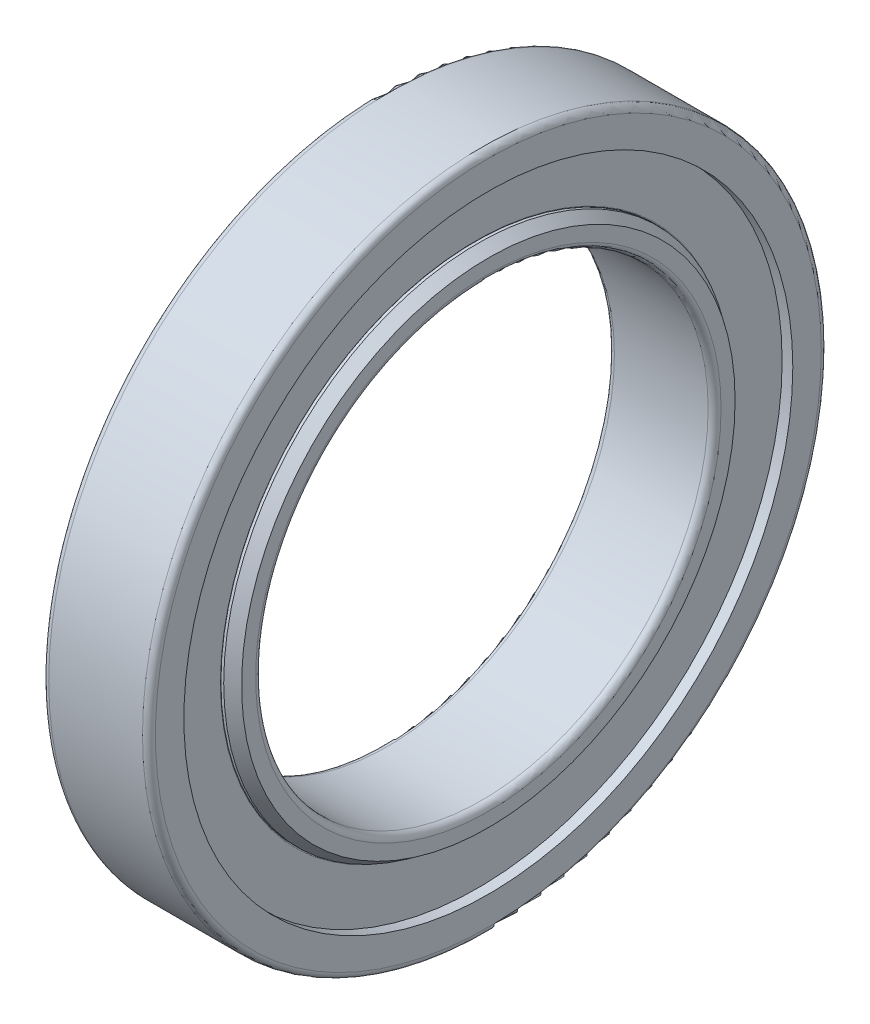
ISO-10303-21;
HEADER;
FILE_DESCRIPTION(('STEP AP214'),'2;1');
FILE_NAME('part.step','',(''),(''),'','','');
FILE_SCHEMA(('AUTOMOTIVE_DESIGN { 1 0 10303 214 1 1 1 1 }'));
ENDSEC;
DATA;
#1=APPLICATION_CONTEXT('core data for automotive mechanical design processes');
#2=APPLICATION_PROTOCOL_DEFINITION('international standard','automotive_design',2000,#1);
#3=PRODUCT_CONTEXT('',#1,'mechanical');
#4=PRODUCT('Part','Part','',(#3));
#5=PRODUCT_RELATED_PRODUCT_CATEGORY('part','',(#4));
#6=PRODUCT_DEFINITION_FORMATION('','',#4);
#7=PRODUCT_DEFINITION_CONTEXT('part definition',#1,'design');
#8=PRODUCT_DEFINITION('design','',#6,#7);
#9=PRODUCT_DEFINITION_SHAPE('','',#8);
#10=(LENGTH_UNIT() NAMED_UNIT(*) SI_UNIT(.MILLI.,.METRE.));
#11=(NAMED_UNIT(*) PLANE_ANGLE_UNIT() SI_UNIT($,.RADIAN.));
#12=(NAMED_UNIT(*) SI_UNIT($,.STERADIAN.) SOLID_ANGLE_UNIT());
#13=UNCERTAINTY_MEASURE_WITH_UNIT(LENGTH_MEASURE(1.E-05),#10,'distance_accuracy_value','');
#14=(GEOMETRIC_REPRESENTATION_CONTEXT(3) GLOBAL_UNCERTAINTY_ASSIGNED_CONTEXT((#13)) GLOBAL_UNIT_ASSIGNED_CONTEXT((#10,
#11,#12)) REPRESENTATION_CONTEXT('',''));
#15=CARTESIAN_POINT('',(0.,0.,0.));
#16=DIRECTION('',(0.,0.,1.));
#17=DIRECTION('',(1.,0.,0.));
#18=AXIS2_PLACEMENT_3D('',#15,#16,#17);
#19=CARTESIAN_POINT('',(-90.,0.,0.));
#20=DIRECTION('',(1.,0.,0.));
#21=DIRECTION('',(0.,0.,-1.));
#22=AXIS2_PLACEMENT_3D('',#19,#20,#21);
#23=CYLINDRICAL_SURFACE('',#22,96.425);
#24=CARTESIAN_POINT('',(-12.2423566956771,0.,0.));
#25=DIRECTION('',(1.,0.,0.));
#26=DIRECTION('',(0.,0.,-1.));
#27=AXIS2_PLACEMENT_3D('',#24,#25,#26);
#28=CIRCLE('',#27,96.425);
#29=CARTESIAN_POINT('',(-12.2423566956771,0.,-96.425));
#30=VERTEX_POINT('',#29);
#31=EDGE_CURVE('E42',#30,#30,#28,.F.);
#32=ORIENTED_EDGE('',*,*,#31,.F.);
#33=EDGE_LOOP('',(#32));
#34=FACE_BOUND('',#33,.T.);
#35=CARTESIAN_POINT('',(-13.2,0.,0.));
#36=DIRECTION('',(1.,0.,0.));
#37=DIRECTION('',(0.,0.,-1.));
#38=AXIS2_PLACEMENT_3D('',#35,#36,#37);
#39=CIRCLE('',#38,96.425);
#40=CARTESIAN_POINT('',(-13.2,0.,-96.425));
#41=VERTEX_POINT('',#40);
#42=EDGE_CURVE('E59',#41,#41,#39,.T.);
#43=ORIENTED_EDGE('',*,*,#42,.F.);
#44=EDGE_LOOP('',(#43));
#45=FACE_BOUND('',#44,.T.);
#46=ADVANCED_FACE('F30',(#34,#45),#23,.F.);
#47=CARTESIAN_POINT('',(-13.2,96.425,0.));
#48=DIRECTION('',(1.,0.,0.));
#49=DIRECTION('',(0.,0.,-1.));
#50=AXIS2_PLACEMENT_3D('',#47,#48,#49);
#51=PLANE('',#50);
#52=ORIENTED_EDGE('',*,*,#42,.T.);
#53=EDGE_LOOP('',(#52));
#54=FACE_BOUND('',#53,.T.);
#55=CARTESIAN_POINT('',(-13.2,0.,0.));
#56=DIRECTION('',(1.,0.,0.));
#57=DIRECTION('',(0.,0.,-1.));
#58=AXIS2_PLACEMENT_3D('',#55,#56,#57);
#59=CIRCLE('',#58,94.19375);
#60=CARTESIAN_POINT('',(-13.2,0.,-94.19375));
#61=VERTEX_POINT('',#60);
#62=EDGE_CURVE('E86',#61,#61,#59,.T.);
#63=ORIENTED_EDGE('',*,*,#62,.F.);
#64=EDGE_LOOP('',(#63));
#65=FACE_BOUND('',#64,.T.);
#66=ADVANCED_FACE('F32',(#54,#65),#51,.T.);
#67=CARTESIAN_POINT('',(-90.,0.,0.));
#68=DIRECTION('',(1.,0.,0.));
#69=DIRECTION('',(0.,0.,-1.));
#70=AXIS2_PLACEMENT_3D('',#67,#68,#69);
#71=CYLINDRICAL_SURFACE('',#70,94.19375);
#72=ORIENTED_EDGE('',*,*,#62,.T.);
#73=EDGE_LOOP('',(#72));
#74=FACE_BOUND('',#73,.T.);
#75=CARTESIAN_POINT('',(-16.5,0.,0.));
#76=DIRECTION('',(1.,0.,0.));
#77=DIRECTION('',(0.,0.,-1.));
#78=AXIS2_PLACEMENT_3D('',#75,#76,#77);
#79=CIRCLE('',#78,94.19375);
#80=CARTESIAN_POINT('',(-16.5,0.,-94.19375));
#81=VERTEX_POINT('',#80);
#82=EDGE_CURVE('E83',#81,#81,#79,.T.);
#83=ORIENTED_EDGE('',*,*,#82,.F.);
#84=EDGE_LOOP('',(#83));
#85=FACE_BOUND('',#84,.T.);
#86=ADVANCED_FACE('F105',(#74,#85),#71,.F.);
#87=CARTESIAN_POINT('',(-16.5,94.19375,0.));
#88=DIRECTION('',(-1.,0.,0.));
#89=DIRECTION('',(0.,0.,1.));
#90=AXIS2_PLACEMENT_3D('',#87,#88,#89);
#91=PLANE('',#90);
#92=ORIENTED_EDGE('',*,*,#82,.T.);
#93=EDGE_LOOP('',(#92));
#94=FACE_BOUND('',#93,.T.);
#95=CARTESIAN_POINT('',(-16.5,0.,0.));
#96=DIRECTION('',(1.,0.,0.));
#97=DIRECTION('',(0.,0.,-1.));
#98=AXIS2_PLACEMENT_3D('',#95,#96,#97);
#99=CIRCLE('',#98,103.);
#100=CARTESIAN_POINT('',(-16.5,0.,-103.));
#101=VERTEX_POINT('',#100);
#102=EDGE_CURVE('E80',#101,#101,#99,.T.);
#103=ORIENTED_EDGE('',*,*,#102,.F.);
#104=EDGE_LOOP('',(#103));
#105=FACE_BOUND('',#104,.T.);
#106=ADVANCED_FACE('F110',(#94,#105),#91,.T.);
#107=CARTESIAN_POINT('',(-14.5,0.,0.));
#108=DIRECTION('',(1.,0.,0.));
#109=DIRECTION('',(0.,0.,-1.));
#110=AXIS2_PLACEMENT_3D('',#107,#108,#109);
#111=TOROIDAL_SURFACE('',#110,103.,2.00000000000002);
#112=ORIENTED_EDGE('',*,*,#102,.T.);
#113=EDGE_LOOP('',(#112));
#114=FACE_BOUND('',#113,.T.);
#115=CARTESIAN_POINT('',(-14.5,0.,0.));
#116=DIRECTION('',(1.,0.,0.));
#117=DIRECTION('',(0.,0.,-1.));
#118=AXIS2_PLACEMENT_3D('',#115,#116,#117);
#119=CIRCLE('',#118,105.);
#120=CARTESIAN_POINT('',(-14.5,0.,-105.));
#121=VERTEX_POINT('',#120);
#122=EDGE_CURVE('E77',#121,#121,#119,.T.);
#123=ORIENTED_EDGE('',*,*,#122,.F.);
#124=EDGE_LOOP('',(#123));
#125=FACE_BOUND('',#124,.T.);
#126=ADVANCED_FACE('F115',(#114,#125),#111,.T.);
#127=CARTESIAN_POINT('',(-90.,0.,0.));
#128=DIRECTION('',(1.,0.,0.));
#129=DIRECTION('',(0.,0.,-1.));
#130=AXIS2_PLACEMENT_3D('',#127,#128,#129);
#131=CYLINDRICAL_SURFACE('',#130,105.);
#132=ORIENTED_EDGE('',*,*,#122,.T.);
#133=EDGE_LOOP('',(#132));
#134=FACE_BOUND('',#133,.T.);
#135=CARTESIAN_POINT('',(14.5,0.,0.));
#136=DIRECTION('',(1.,0.,0.));
#137=DIRECTION('',(0.,0.,-1.));
#138=AXIS2_PLACEMENT_3D('',#135,#136,#137);
#139=CIRCLE('',#138,105.);
#140=CARTESIAN_POINT('',(14.5,0.,-105.));
#141=VERTEX_POINT('',#140);
#142=EDGE_CURVE('E74',#141,#141,#139,.T.);
#143=ORIENTED_EDGE('',*,*,#142,.F.);
#144=EDGE_LOOP('',(#143));
#145=FACE_BOUND('',#144,.T.);
#146=ADVANCED_FACE('F121',(#134,#145),#131,.T.);
#147=CARTESIAN_POINT('',(14.5,0.,0.));
#148=DIRECTION('',(1.,0.,0.));
#149=DIRECTION('',(0.,0.,-1.));
#150=AXIS2_PLACEMENT_3D('',#147,#148,#149);
#151=TOROIDAL_SURFACE('',#150,103.,2.00000000000001);
#152=ORIENTED_EDGE('',*,*,#142,.T.);
#153=EDGE_LOOP('',(#152));
#154=FACE_BOUND('',#153,.T.);
#155=CARTESIAN_POINT('',(16.5,0.,0.));
#156=DIRECTION('',(1.,0.,0.));
#157=DIRECTION('',(0.,0.,-1.));
#158=AXIS2_PLACEMENT_3D('',#155,#156,#157);
#159=CIRCLE('',#158,103.);
#160=CARTESIAN_POINT('',(16.5,0.,-103.));
#161=VERTEX_POINT('',#160);
#162=EDGE_CURVE('E71',#161,#161,#159,.T.);
#163=ORIENTED_EDGE('',*,*,#162,.F.);
#164=EDGE_LOOP('',(#163));
#165=FACE_BOUND('',#164,.T.);
#166=ADVANCED_FACE('F127',(#154,#165),#151,.T.);
#167=CARTESIAN_POINT('',(16.5,103.,0.));
#168=DIRECTION('',(1.,0.,0.));
#169=DIRECTION('',(0.,0.,-1.));
#170=AXIS2_PLACEMENT_3D('',#167,#168,#169);
#171=PLANE('',#170);
#172=ORIENTED_EDGE('',*,*,#162,.T.);
#173=EDGE_LOOP('',(#172));
#174=FACE_BOUND('',#173,.T.);
#175=CARTESIAN_POINT('',(16.5,0.,0.));
#176=DIRECTION('',(1.,0.,0.));
#177=DIRECTION('',(0.,0.,-1.));
#178=AXIS2_PLACEMENT_3D('',#175,#176,#177);
#179=CIRCLE('',#178,94.1937500000001);
#180=CARTESIAN_POINT('',(16.5,0.,-94.1937500000001));
#181=VERTEX_POINT('',#180);
#182=EDGE_CURVE('E68',#181,#181,#179,.T.);
#183=ORIENTED_EDGE('',*,*,#182,.F.);
#184=EDGE_LOOP('',(#183));
#185=FACE_BOUND('',#184,.T.);
#186=ADVANCED_FACE('F133',(#174,#185),#171,.T.);
#187=CARTESIAN_POINT('',(-90.,0.,0.));
#188=DIRECTION('',(1.,0.,0.));
#189=DIRECTION('',(0.,0.,-1.));
#190=AXIS2_PLACEMENT_3D('',#187,#188,#189);
#191=CYLINDRICAL_SURFACE('',#190,94.1937500000001);
#192=ORIENTED_EDGE('',*,*,#182,.T.);
#193=EDGE_LOOP('',(#192));
#194=FACE_BOUND('',#193,.T.);
#195=CARTESIAN_POINT('',(13.2,0.,0.));
#196=DIRECTION('',(1.,0.,0.));
#197=DIRECTION('',(0.,0.,-1.));
#198=AXIS2_PLACEMENT_3D('',#195,#196,#197);
#199=CIRCLE('',#198,94.1937500000001);
#200=CARTESIAN_POINT('',(13.2,0.,-94.1937500000001));
#201=VERTEX_POINT('',#200);
#202=EDGE_CURVE('E65',#201,#201,#199,.T.);
#203=ORIENTED_EDGE('',*,*,#202,.F.);
#204=EDGE_LOOP('',(#203));
#205=FACE_BOUND('',#204,.T.);
#206=ADVANCED_FACE('F139',(#194,#205),#191,.F.);
#207=CARTESIAN_POINT('',(13.2,94.1937500000001,0.));
#208=DIRECTION('',(-1.,0.,0.));
#209=DIRECTION('',(0.,0.,1.));
#210=AXIS2_PLACEMENT_3D('',#207,#208,#209);
#211=PLANE('',#210);
#212=ORIENTED_EDGE('',*,*,#202,.T.);
#213=EDGE_LOOP('',(#212));
#214=FACE_BOUND('',#213,.T.);
#215=CARTESIAN_POINT('',(13.2,0.,0.));
#216=DIRECTION('',(1.,0.,0.));
#217=DIRECTION('',(0.,0.,-1.));
#218=AXIS2_PLACEMENT_3D('',#215,#216,#217);
#219=CIRCLE('',#218,96.425);
#220=CARTESIAN_POINT('',(13.2,0.,-96.425));
#221=VERTEX_POINT('',#220);
#222=EDGE_CURVE('E62',#221,#221,#219,.T.);
#223=ORIENTED_EDGE('',*,*,#222,.F.);
#224=EDGE_LOOP('',(#223));
#225=FACE_BOUND('',#224,.T.);
#226=ADVANCED_FACE('F145',(#214,#225),#211,.T.);
#227=CARTESIAN_POINT('',(12.2423566956772,0.,0.));
#228=DIRECTION('',(-1.,0.,0.));
#229=DIRECTION('',(0.,0.,1.));
#230=AXIS2_PLACEMENT_3D('',#227,#228,#229);
#231=CIRCLE('',#230,96.425);
#232=CARTESIAN_POINT('',(12.2423566956772,0.,96.425));
#233=VERTEX_POINT('',#232);
#234=EDGE_CURVE('E89',#233,#233,#231,.F.);
#235=ORIENTED_EDGE('',*,*,#234,.F.);
#236=EDGE_LOOP('',(#235));
#237=FACE_BOUND('',#236,.T.);
#238=ORIENTED_EDGE('',*,*,#222,.T.);
#239=EDGE_LOOP('',(#238));
#240=FACE_BOUND('',#239,.T.);
#241=ADVANCED_FACE('F100',(#237,#240),#23,.F.);
#242=CARTESIAN_POINT('',(-12.1828,0.,0.));
#243=DIRECTION('',(1.,0.,0.));
#244=DIRECTION('',(0.,0.,-1.));
#245=AXIS2_PLACEMENT_3D('',#242,#243,#244);
#246=TOROIDAL_SURFACE('',#245,96.0728,0.357199999999995);
#247=ORIENTED_EDGE('',*,*,#31,.T.);
#248=EDGE_LOOP('',(#247));
#249=FACE_BOUND('',#248,.T.);
#250=CARTESIAN_POINT('',(-12.54,0.,0.));
#251=DIRECTION('',(1.,0.,0.));
#252=DIRECTION('',(0.,0.,-1.));
#253=AXIS2_PLACEMENT_3D('',#250,#251,#252);
#254=CIRCLE('',#253,96.0728);
#255=CARTESIAN_POINT('',(-12.54,0.,-96.0728));
#256=VERTEX_POINT('',#255);
#257=EDGE_CURVE('E56',#256,#256,#254,.T.);
#258=ORIENTED_EDGE('',*,*,#257,.T.);
#259=EDGE_LOOP('',(#258));
#260=FACE_BOUND('',#259,.T.);
#261=ADVANCED_FACE('F94',(#249,#260),#246,.T.);
#262=CARTESIAN_POINT('',(-12.54,96.0728,0.));
#263=DIRECTION('',(-1.,0.,0.));
#264=DIRECTION('',(0.,0.,1.));
#265=AXIS2_PLACEMENT_3D('',#262,#263,#264);
#266=PLANE('',#265);
#267=CARTESIAN_POINT('',(-12.54,0.,0.));
#268=DIRECTION('',(1.,0.,0.));
#269=DIRECTION('',(0.,0.,-1.));
#270=AXIS2_PLACEMENT_3D('',#267,#268,#269);
#271=CIRCLE('',#270,78.9272);
#272=CARTESIAN_POINT('',(-12.54,0.,-78.9272));
#273=VERTEX_POINT('',#272);
#274=EDGE_CURVE('E53',#273,#273,#271,.T.);
#275=ORIENTED_EDGE('',*,*,#274,.T.);
#276=EDGE_LOOP('',(#275));
#277=FACE_BOUND('',#276,.T.);
#278=ORIENTED_EDGE('',*,*,#257,.F.);
#279=EDGE_LOOP('',(#278));
#280=FACE_BOUND('',#279,.T.);
#281=ADVANCED_FACE('F159',(#277,#280),#266,.T.);
#282=CARTESIAN_POINT('',(-12.1828,0.,0.));
#283=DIRECTION('',(1.,0.,0.));
#284=DIRECTION('',(0.,0.,-1.));
#285=AXIS2_PLACEMENT_3D('',#282,#283,#284);
#286=TOROIDAL_SURFACE('',#285,78.9272,0.357200000000002);
#287=CARTESIAN_POINT('',(-12.2423566956775,0.,0.));
#288=DIRECTION('',(1.,0.,0.));
#289=DIRECTION('',(0.,0.,-1.));
#290=AXIS2_PLACEMENT_3D('',#287,#288,#289);
#291=CIRCLE('',#290,78.575);
#292=CARTESIAN_POINT('',(-12.2423566956775,0.,-78.575));
#293=VERTEX_POINT('',#292);
#294=EDGE_CURVE('E10',#293,#293,#291,.F.);
#295=ORIENTED_EDGE('',*,*,#294,.F.);
#296=EDGE_LOOP('',(#295));
#297=FACE_BOUND('',#296,.T.);
#298=ORIENTED_EDGE('',*,*,#274,.F.);
#299=EDGE_LOOP('',(#298));
#300=FACE_BOUND('',#299,.T.);
#301=ADVANCED_FACE('F165',(#297,#300),#286,.T.);
#302=CARTESIAN_POINT('',(12.1828,0.,0.));
#303=DIRECTION('',(1.,0.,0.));
#304=DIRECTION('',(0.,0.,-1.));
#305=AXIS2_PLACEMENT_3D('',#302,#303,#304);
#306=TOROIDAL_SURFACE('',#305,78.9272,0.357200000000002);
#307=CARTESIAN_POINT('',(12.2423566956775,0.,0.));
#308=DIRECTION('',(-1.,0.,0.));
#309=DIRECTION('',(0.,0.,1.));
#310=AXIS2_PLACEMENT_3D('',#307,#308,#309);
#311=CIRCLE('',#310,78.575);
#312=CARTESIAN_POINT('',(12.2423566956775,0.,78.575));
#313=VERTEX_POINT('',#312);
#314=EDGE_CURVE('E34',#313,#313,#311,.F.);
#315=ORIENTED_EDGE('',*,*,#314,.F.);
#316=EDGE_LOOP('',(#315));
#317=FACE_BOUND('',#316,.T.);
#318=CARTESIAN_POINT('',(12.54,0.,0.));
#319=DIRECTION('',(1.,0.,0.));
#320=DIRECTION('',(0.,0.,-1.));
#321=AXIS2_PLACEMENT_3D('',#318,#319,#320);
#322=CIRCLE('',#321,78.9272);
#323=CARTESIAN_POINT('',(12.54,0.,-78.9272));
#324=VERTEX_POINT('',#323);
#325=EDGE_CURVE('E50',#324,#324,#322,.T.);
#326=ORIENTED_EDGE('',*,*,#325,.T.);
#327=EDGE_LOOP('',(#326));
#328=FACE_BOUND('',#327,.T.);
#329=ADVANCED_FACE('F169',(#317,#328),#306,.T.);
#330=CARTESIAN_POINT('',(12.54,78.9272,0.));
#331=DIRECTION('',(1.,0.,0.));
#332=DIRECTION('',(0.,0.,-1.));
#333=AXIS2_PLACEMENT_3D('',#330,#331,#332);
#334=PLANE('',#333);
#335=CARTESIAN_POINT('',(12.54,0.,0.));
#336=DIRECTION('',(1.,0.,0.));
#337=DIRECTION('',(0.,0.,-1.));
#338=AXIS2_PLACEMENT_3D('',#335,#336,#337);
#339=CIRCLE('',#338,96.0728);
#340=CARTESIAN_POINT('',(12.54,0.,-96.0728));
#341=VERTEX_POINT('',#340);
#342=EDGE_CURVE('E47',#341,#341,#339,.T.);
#343=ORIENTED_EDGE('',*,*,#342,.T.);
#344=EDGE_LOOP('',(#343));
#345=FACE_BOUND('',#344,.T.);
#346=ORIENTED_EDGE('',*,*,#325,.F.);
#347=EDGE_LOOP('',(#346));
#348=FACE_BOUND('',#347,.T.);
#349=ADVANCED_FACE('F173',(#345,#348),#334,.T.);
#350=CARTESIAN_POINT('',(12.1828,0.,0.));
#351=DIRECTION('',(1.,0.,0.));
#352=DIRECTION('',(0.,0.,-1.));
#353=AXIS2_PLACEMENT_3D('',#350,#351,#352);
#354=TOROIDAL_SURFACE('',#353,96.0728,0.357200000000002);
#355=ORIENTED_EDGE('',*,*,#234,.T.);
#356=EDGE_LOOP('',(#355));
#357=FACE_BOUND('',#356,.T.);
#358=ORIENTED_EDGE('',*,*,#342,.F.);
#359=EDGE_LOOP('',(#358));
#360=FACE_BOUND('',#359,.T.);
#361=ADVANCED_FACE('F177',(#357,#360),#354,.T.);
#362=CARTESIAN_POINT('',(-90.,0.,0.));
#363=DIRECTION('',(1.,0.,0.));
#364=DIRECTION('',(0.,0.,-1.));
#365=AXIS2_PLACEMENT_3D('',#362,#363,#364);
#366=CYLINDRICAL_SURFACE('',#365,78.575);
#367=ORIENTED_EDGE('',*,*,#294,.T.);
#368=EDGE_LOOP('',(#367));
#369=FACE_BOUND('',#368,.T.);
#370=CARTESIAN_POINT('',(-13.2,0.,0.));
#371=DIRECTION('',(1.,0.,0.));
#372=DIRECTION('',(0.,0.,-1.));
#373=AXIS2_PLACEMENT_3D('',#370,#371,#372);
#374=CIRCLE('',#373,78.575);
#375=CARTESIAN_POINT('',(-13.2,0.,-78.575));
#376=VERTEX_POINT('',#375);
#377=EDGE_CURVE('E45',#376,#376,#374,.T.);
#378=ORIENTED_EDGE('',*,*,#377,.T.);
#379=EDGE_LOOP('',(#378));
#380=FACE_BOUND('',#379,.T.);
#381=ADVANCED_FACE('F181',(#369,#380),#366,.T.);
#382=ORIENTED_EDGE('',*,*,#314,.T.);
#383=EDGE_LOOP('',(#382));
#384=FACE_BOUND('',#383,.T.);
#385=CARTESIAN_POINT('',(13.2,0.,0.));
#386=DIRECTION('',(1.,0.,0.));
#387=DIRECTION('',(0.,0.,-1.));
#388=AXIS2_PLACEMENT_3D('',#385,#386,#387);
#389=CIRCLE('',#388,78.575);
#390=CARTESIAN_POINT('',(13.2,0.,-78.575));
#391=VERTEX_POINT('',#390);
#392=EDGE_CURVE('E219',#391,#391,#389,.T.);
#393=ORIENTED_EDGE('',*,*,#392,.F.);
#394=EDGE_LOOP('',(#393));
#395=FACE_BOUND('',#394,.T.);
#396=ADVANCED_FACE('F183',(#384,#395),#366,.T.);
#397=CARTESIAN_POINT('',(-13.2,0.,0.));
#398=DIRECTION('',(1.,0.,0.));
#399=DIRECTION('',(0.,0.,-1.));
#400=AXIS2_PLACEMENT_3D('',#397,#398,#399);
#401=CONICAL_SURFACE('',#400,78.575,0.594529925988689);
#402=CARTESIAN_POINT('',(-16.5,0.,0.));
#403=DIRECTION('',(1.,0.,0.));
#404=DIRECTION('',(0.,0.,-1.));
#405=AXIS2_PLACEMENT_3D('',#402,#403,#404);
#406=CIRCLE('',#405,76.34375);
#407=CARTESIAN_POINT('',(-16.5,0.,-76.34375));
#408=VERTEX_POINT('',#407);
#409=EDGE_CURVE('E237',#408,#408,#406,.T.);
#410=ORIENTED_EDGE('',*,*,#409,.T.);
#411=EDGE_LOOP('',(#410));
#412=FACE_BOUND('',#411,.T.);
#413=ORIENTED_EDGE('',*,*,#377,.F.);
#414=EDGE_LOOP('',(#413));
#415=FACE_BOUND('',#414,.T.);
#416=ADVANCED_FACE('F186',(#412,#415),#401,.T.);
#417=CARTESIAN_POINT('',(-16.5,76.34375,0.));
#418=DIRECTION('',(-1.,0.,0.));
#419=DIRECTION('',(0.,0.,1.));
#420=AXIS2_PLACEMENT_3D('',#417,#418,#419);
#421=PLANE('',#420);
#422=CARTESIAN_POINT('',(-16.5,0.,0.));
#423=DIRECTION('',(1.,0.,0.));
#424=DIRECTION('',(0.,0.,-1.));
#425=AXIS2_PLACEMENT_3D('',#422,#423,#424);
#426=CIRCLE('',#425,72.);
#427=CARTESIAN_POINT('',(-16.5,0.,-72.));
#428=VERTEX_POINT('',#427);
#429=EDGE_CURVE('E235',#428,#428,#426,.T.);
#430=ORIENTED_EDGE('',*,*,#429,.T.);
#431=EDGE_LOOP('',(#430));
#432=FACE_BOUND('',#431,.T.);
#433=ORIENTED_EDGE('',*,*,#409,.F.);
#434=EDGE_LOOP('',(#433));
#435=FACE_BOUND('',#434,.T.);
#436=ADVANCED_FACE('F190',(#432,#435),#421,.T.);
#437=CARTESIAN_POINT('',(-14.5,0.,0.));
#438=DIRECTION('',(1.,0.,0.));
#439=DIRECTION('',(0.,0.,-1.));
#440=AXIS2_PLACEMENT_3D('',#437,#438,#439);
#441=TOROIDAL_SURFACE('',#440,72.,1.99999999999999);
#442=CARTESIAN_POINT('',(-14.5,0.,0.));
#443=DIRECTION('',(1.,0.,0.));
#444=DIRECTION('',(0.,0.,-1.));
#445=AXIS2_PLACEMENT_3D('',#442,#443,#444);
#446=CIRCLE('',#445,70.);
#447=CARTESIAN_POINT('',(-14.5,0.,-70.));
#448=VERTEX_POINT('',#447);
#449=EDGE_CURVE('E232',#448,#448,#446,.T.);
#450=ORIENTED_EDGE('',*,*,#449,.T.);
#451=EDGE_LOOP('',(#450));
#452=FACE_BOUND('',#451,.T.);
#453=ORIENTED_EDGE('',*,*,#429,.F.);
#454=EDGE_LOOP('',(#453));
#455=FACE_BOUND('',#454,.T.);
#456=ADVANCED_FACE('F194',(#452,#455),#441,.T.);
#457=CARTESIAN_POINT('',(-90.,0.,0.));
#458=DIRECTION('',(1.,0.,0.));
#459=DIRECTION('',(0.,0.,-1.));
#460=AXIS2_PLACEMENT_3D('',#457,#458,#459);
#461=CYLINDRICAL_SURFACE('',#460,70.);
#462=CARTESIAN_POINT('',(14.5,0.,0.));
#463=DIRECTION('',(1.,0.,0.));
#464=DIRECTION('',(0.,0.,-1.));
#465=AXIS2_PLACEMENT_3D('',#462,#463,#464);
#466=CIRCLE('',#465,70.);
#467=CARTESIAN_POINT('',(14.5,0.,-70.));
#468=VERTEX_POINT('',#467);
#469=EDGE_CURVE('E226',#468,#468,#466,.T.);
#470=ORIENTED_EDGE('',*,*,#469,.T.);
#471=EDGE_LOOP('',(#470));
#472=FACE_BOUND('',#471,.T.);
#473=ORIENTED_EDGE('',*,*,#449,.F.);
#474=EDGE_LOOP('',(#473));
#475=FACE_BOUND('',#474,.T.);
#476=ADVANCED_FACE('F198',(#472,#475),#461,.F.);
#477=CARTESIAN_POINT('',(14.5,0.,0.));
#478=DIRECTION('',(1.,0.,0.));
#479=DIRECTION('',(0.,0.,-1.));
#480=AXIS2_PLACEMENT_3D('',#477,#478,#479);
#481=TOROIDAL_SURFACE('',#480,72.,1.99999999999999);
#482=CARTESIAN_POINT('',(16.5,0.,0.));
#483=DIRECTION('',(1.,0.,0.));
#484=DIRECTION('',(0.,0.,-1.));
#485=AXIS2_PLACEMENT_3D('',#482,#483,#484);
#486=CIRCLE('',#485,72.);
#487=CARTESIAN_POINT('',(16.5,0.,-72.));
#488=VERTEX_POINT('',#487);
#489=EDGE_CURVE('E223',#488,#488,#486,.T.);
#490=ORIENTED_EDGE('',*,*,#489,.T.);
#491=EDGE_LOOP('',(#490));
#492=FACE_BOUND('',#491,.T.);
#493=ORIENTED_EDGE('',*,*,#469,.F.);
#494=EDGE_LOOP('',(#493));
#495=FACE_BOUND('',#494,.T.);
#496=ADVANCED_FACE('F202',(#492,#495),#481,.T.);
#497=CARTESIAN_POINT('',(16.5,72.,0.));
#498=DIRECTION('',(1.,0.,0.));
#499=DIRECTION('',(0.,0.,-1.));
#500=AXIS2_PLACEMENT_3D('',#497,#498,#499);
#501=PLANE('',#500);
#502=CARTESIAN_POINT('',(16.5,0.,0.));
#503=DIRECTION('',(1.,0.,0.));
#504=DIRECTION('',(0.,0.,-1.));
#505=AXIS2_PLACEMENT_3D('',#502,#503,#504);
#506=CIRCLE('',#505,76.34375);
#507=CARTESIAN_POINT('',(16.5,0.,-76.34375));
#508=VERTEX_POINT('',#507);
#509=EDGE_CURVE('E222',#508,#508,#506,.T.);
#510=ORIENTED_EDGE('',*,*,#509,.T.);
#511=EDGE_LOOP('',(#510));
#512=FACE_BOUND('',#511,.T.);
#513=ORIENTED_EDGE('',*,*,#489,.F.);
#514=EDGE_LOOP('',(#513));
#515=FACE_BOUND('',#514,.T.);
#516=ADVANCED_FACE('F206',(#512,#515),#501,.T.);
#517=CARTESIAN_POINT('',(16.5,0.,0.));
#518=DIRECTION('',(-1.,0.,0.));
#519=DIRECTION('',(0.,0.,1.));
#520=AXIS2_PLACEMENT_3D('',#517,#518,#519);
#521=CONICAL_SURFACE('',#520,76.34375,0.594529925988711);
#522=ORIENTED_EDGE('',*,*,#392,.T.);
#523=EDGE_LOOP('',(#522));
#524=FACE_BOUND('',#523,.T.);
#525=ORIENTED_EDGE('',*,*,#509,.F.);
#526=EDGE_LOOP('',(#525));
#527=FACE_BOUND('',#526,.T.);
#528=ADVANCED_FACE('F210',(#524,#527),#521,.T.);
#529=CLOSED_SHELL('',(#46,#66,#86,#106,#126,#146,#166,#186,#206,#226,#241,#261,#281,#301,#329,
#349,#361,#381,#396,#416,#436,#456,#476,#496,#516,#528));
#530=MANIFOLD_SOLID_BREP('B2',#529);
#531=ADVANCED_BREP_SHAPE_REPRESENTATION('',(#18,#530),#14);
#532=SHAPE_DEFINITION_REPRESENTATION(#9,#531);
ENDSEC;
END-ISO-10303-21;
